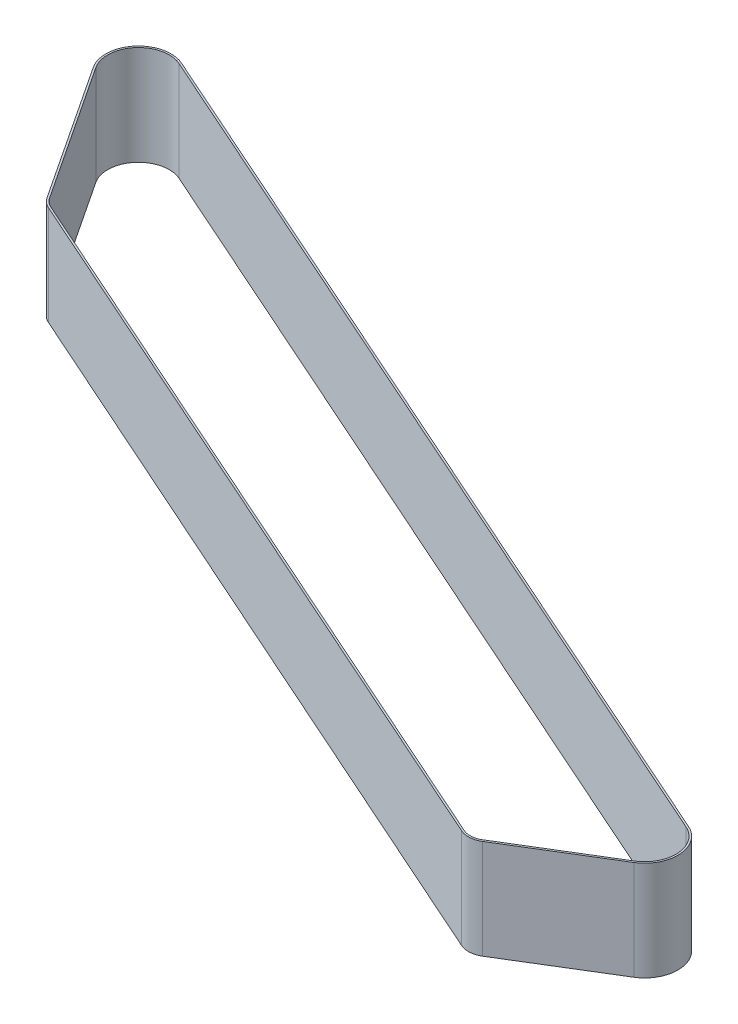
ISO-10303-21;
HEADER;
FILE_DESCRIPTION(('STEP AP214'),'2;1');
FILE_NAME('part.step','',(''),(''),'','','');
FILE_SCHEMA(('AUTOMOTIVE_DESIGN { 1 0 10303 214 1 1 1 1 }'));
ENDSEC;
DATA;
#1=APPLICATION_CONTEXT('core data for automotive mechanical design processes');
#2=APPLICATION_PROTOCOL_DEFINITION('international standard','automotive_design',2000,#1);
#3=PRODUCT_CONTEXT('',#1,'mechanical');
#4=PRODUCT('Part','Part','',(#3));
#5=PRODUCT_RELATED_PRODUCT_CATEGORY('part','',(#4));
#6=PRODUCT_DEFINITION_FORMATION('','',#4);
#7=PRODUCT_DEFINITION_CONTEXT('part definition',#1,'design');
#8=PRODUCT_DEFINITION('design','',#6,#7);
#9=PRODUCT_DEFINITION_SHAPE('','',#8);
#10=(LENGTH_UNIT() NAMED_UNIT(*) SI_UNIT(.MILLI.,.METRE.));
#11=(NAMED_UNIT(*) PLANE_ANGLE_UNIT() SI_UNIT($,.RADIAN.));
#12=(NAMED_UNIT(*) SI_UNIT($,.STERADIAN.) SOLID_ANGLE_UNIT());
#13=UNCERTAINTY_MEASURE_WITH_UNIT(LENGTH_MEASURE(1.E-05),#10,'distance_accuracy_value','');
#14=(GEOMETRIC_REPRESENTATION_CONTEXT(3) GLOBAL_UNCERTAINTY_ASSIGNED_CONTEXT((#13)) GLOBAL_UNIT_ASSIGNED_CONTEXT((#10,
#11,#12)) REPRESENTATION_CONTEXT('',''));
#15=CARTESIAN_POINT('',(0.,0.,0.));
#16=DIRECTION('',(0.,0.,1.));
#17=DIRECTION('',(1.,0.,0.));
#18=AXIS2_PLACEMENT_3D('',#15,#16,#17);
#19=CARTESIAN_POINT('',(-108.646299897246,54.,71.727165724175));
#20=DIRECTION('',(0.83453662592116,0.,-0.550952466185719));
#21=DIRECTION('',(-0.550952466185719,0.,-0.83453662592116));
#22=AXIS2_PLACEMENT_3D('',#19,#20,#21);
#23=PLANE('',#22);
#24=DIRECTION('',(0.550952466185719,0.,0.83453662592116));
#25=VECTOR('',#24,1.);
#26=CARTESIAN_POINT('',(-108.646299897246,0.,71.727165724175));
#27=LINE('',#26,#25);
#28=CARTESIAN_POINT('',(-246.078397412732,0.,-136.443458772459));
#29=VERTEX_POINT('',#28);
#30=CARTESIAN_POINT('',(-197.199257088661,0.,-62.4054330850907));
#31=VERTEX_POINT('',#30);
#32=EDGE_CURVE('E209',#29,#31,#27,.T.);
#33=ORIENTED_EDGE('',*,*,#32,.T.);
#34=DIRECTION('',(0.,-1.,0.));
#35=VECTOR('',#34,1.);
#36=CARTESIAN_POINT('',(-197.199257088661,54.,-62.4054330850907));
#37=LINE('',#36,#35);
#38=CARTESIAN_POINT('',(-197.199257088661,54.,-62.4054330850907));
#39=VERTEX_POINT('',#38);
#40=EDGE_CURVE('E11',#39,#31,#37,.T.);
#41=ORIENTED_EDGE('',*,*,#40,.F.);
#42=DIRECTION('',(0.550952466185719,0.,0.83453662592116));
#43=VECTOR('',#42,1.);
#44=CARTESIAN_POINT('',(-108.646299897246,54.,71.727165724175));
#45=LINE('',#44,#43);
#46=CARTESIAN_POINT('',(-246.078397412732,54.,-136.443458772459));
#47=VERTEX_POINT('',#46);
#48=EDGE_CURVE('E289',#47,#39,#45,.T.);
#49=ORIENTED_EDGE('',*,*,#48,.F.);
#50=DIRECTION('',(0.,-1.,0.));
#51=VECTOR('',#50,1.);
#52=CARTESIAN_POINT('',(-246.078397412732,54.,-136.443458772459));
#53=LINE('',#52,#51);
#54=EDGE_CURVE('E229',#47,#29,#53,.T.);
#55=ORIENTED_EDGE('',*,*,#54,.T.);
#56=EDGE_LOOP('',(#33,#41,#49,#55));
#57=FACE_BOUND('',#56,.T.);
#58=ADVANCED_FACE('F39',(#57),#23,.F.);
#59=CARTESIAN_POINT('',(-187.602085890568,54.,-68.7413864462265));
#60=DIRECTION('',(0.,-1.,0.));
#61=DIRECTION('',(0.,0.,-1.));
#62=AXIS2_PLACEMENT_3D('',#59,#60,#61);
#63=CYLINDRICAL_SURFACE('',#62,11.5);
#64=CARTESIAN_POINT('',(-187.602085890568,0.,-68.7413864462265));
#65=DIRECTION('',(0.,1.,0.));
#66=DIRECTION('',(0.,0.,1.));
#67=AXIS2_PLACEMENT_3D('',#64,#65,#66);
#68=CIRCLE('',#67,11.5);
#69=CARTESIAN_POINT('',(-192.288857086502,0.,-58.2397591553271));
#70=VERTEX_POINT('',#69);
#71=EDGE_CURVE('E212',#31,#70,#68,.T.);
#72=ORIENTED_EDGE('',*,*,#71,.T.);
#73=DIRECTION('',(0.,-1.,0.));
#74=VECTOR('',#73,1.);
#75=CARTESIAN_POINT('',(-192.288857086502,54.,-58.2397591553271));
#76=LINE('',#75,#74);
#77=CARTESIAN_POINT('',(-192.288857086502,54.,-58.2397591553271));
#78=VERTEX_POINT('',#77);
#79=EDGE_CURVE('E49',#78,#70,#76,.T.);
#80=ORIENTED_EDGE('',*,*,#79,.F.);
#81=CARTESIAN_POINT('',(-187.602085890568,54.,-68.7413864462265));
#82=DIRECTION('',(0.,1.,0.));
#83=DIRECTION('',(0.,0.,1.));
#84=AXIS2_PLACEMENT_3D('',#81,#82,#83);
#85=CIRCLE('',#84,11.5);
#86=EDGE_CURVE('E291',#39,#78,#85,.T.);
#87=ORIENTED_EDGE('',*,*,#86,.F.);
#88=ORIENTED_EDGE('',*,*,#40,.T.);
#89=EDGE_LOOP('',(#72,#80,#87,#88));
#90=FACE_BOUND('',#89,.T.);
#91=ADVANCED_FACE('F321',(#90),#63,.T.);
#92=CARTESIAN_POINT('',(-10.2631122090156,54.,22.9965096988866));
#93=DIRECTION('',(-0.407545321385573,0.,0.913184981817337));
#94=DIRECTION('',(0.913184981817337,0.,0.407545321385573));
#95=AXIS2_PLACEMENT_3D('',#92,#93,#94);
#96=PLANE('',#95);
#97=DIRECTION('',(-0.913184981817337,0.,-0.407545321385572));
#98=VECTOR('',#97,1.);
#99=CARTESIAN_POINT('',(-10.2631122090156,0.,22.9965096988866));
#100=LINE('',#99,#98);
#101=CARTESIAN_POINT('',(213.190233658603,0.,122.721502410731));
#102=VERTEX_POINT('',#101);
#103=EDGE_CURVE('E215',#102,#70,#100,.T.);
#104=ORIENTED_EDGE('',*,*,#103,.F.);
#105=DIRECTION('',(0.,-1.,0.));
#106=VECTOR('',#105,1.);
#107=CARTESIAN_POINT('',(213.190233658603,54.,122.721502410731));
#108=LINE('',#107,#106);
#109=CARTESIAN_POINT('',(213.190233658603,54.,122.721502410731));
#110=VERTEX_POINT('',#109);
#111=EDGE_CURVE('E235',#110,#102,#108,.T.);
#112=ORIENTED_EDGE('',*,*,#111,.F.);
#113=DIRECTION('',(-0.913184981817337,0.,-0.407545321385572));
#114=VECTOR('',#113,1.);
#115=CARTESIAN_POINT('',(-10.2631122090156,54.,22.9965096988866));
#116=LINE('',#115,#114);
#117=EDGE_CURVE('E293',#110,#78,#116,.T.);
#118=ORIENTED_EDGE('',*,*,#117,.T.);
#119=ORIENTED_EDGE('',*,*,#79,.T.);
#120=EDGE_LOOP('',(#104,#112,#118,#119));
#121=FACE_BOUND('',#120,.T.);
#122=ADVANCED_FACE('F326',(#121),#96,.T.);
#123=CARTESIAN_POINT('',(217.877004854537,54.,112.219875119832));
#124=DIRECTION('',(0.,-1.,0.));
#125=DIRECTION('',(0.,0.,-1.));
#126=AXIS2_PLACEMENT_3D('',#123,#124,#125);
#127=CYLINDRICAL_SURFACE('',#126,11.5);
#128=CARTESIAN_POINT('',(217.877004854537,0.,112.219875119832));
#129=DIRECTION('',(0.,1.,0.));
#130=DIRECTION('',(0.,0.,1.));
#131=AXIS2_PLACEMENT_3D('',#128,#129,#130);
#132=CIRCLE('',#131,11.5);
#133=CARTESIAN_POINT('',(223.875273721408,0.,122.031642065736));
#134=VERTEX_POINT('',#133);
#135=EDGE_CURVE('E218',#102,#134,#132,.T.);
#136=ORIENTED_EDGE('',*,*,#135,.T.);
#137=DIRECTION('',(0.,-1.,0.));
#138=VECTOR('',#137,1.);
#139=CARTESIAN_POINT('',(223.875273721408,54.,122.031642065736));
#140=LINE('',#139,#138);
#141=CARTESIAN_POINT('',(223.875273721408,54.,122.031642065736));
#142=VERTEX_POINT('',#141);
#143=EDGE_CURVE('E233',#142,#134,#140,.T.);
#144=ORIENTED_EDGE('',*,*,#143,.F.);
#145=CARTESIAN_POINT('',(217.877004854537,54.,112.219875119832));
#146=DIRECTION('',(0.,1.,0.));
#147=DIRECTION('',(0.,0.,1.));
#148=AXIS2_PLACEMENT_3D('',#145,#146,#147);
#149=CIRCLE('',#148,11.5);
#150=EDGE_CURVE('E296',#110,#142,#149,.T.);
#151=ORIENTED_EDGE('',*,*,#150,.F.);
#152=ORIENTED_EDGE('',*,*,#111,.T.);
#153=EDGE_LOOP('',(#136,#144,#151,#152));
#154=FACE_BOUND('',#153,.T.);
#155=ADVANCED_FACE('F359',(#154),#127,.T.);
#156=CARTESIAN_POINT('',(115.212576608811,54.,188.460866962163));
#157=DIRECTION('',(0.521588597119238,0.,0.853197125730733));
#158=DIRECTION('',(0.853197125730734,0.,-0.521588597119238));
#159=AXIS2_PLACEMENT_3D('',#156,#157,#158);
#160=PLANE('',#159);
#161=DIRECTION('',(-0.853197125730734,0.,0.521588597119238));
#162=VECTOR('',#161,1.);
#163=CARTESIAN_POINT('',(115.212576608811,0.,188.460866962163));
#164=LINE('',#163,#162);
#165=CARTESIAN_POINT('',(274.861498447239,0.,90.8620182764203));
#166=VERTEX_POINT('',#165);
#167=EDGE_CURVE('E221',#166,#134,#164,.T.);
#168=ORIENTED_EDGE('',*,*,#167,.F.);
#169=DIRECTION('',(0.,-1.,0.));
#170=VECTOR('',#169,1.);
#171=CARTESIAN_POINT('',(274.861498447239,54.,90.8620182764203));
#172=LINE('',#171,#170);
#173=CARTESIAN_POINT('',(274.861498447239,54.,90.8620182764203));
#174=VERTEX_POINT('',#173);
#175=EDGE_CURVE('E177',#174,#166,#172,.T.);
#176=ORIENTED_EDGE('',*,*,#175,.F.);
#177=DIRECTION('',(-0.853197125730734,0.,0.521588597119238));
#178=VECTOR('',#177,1.);
#179=CARTESIAN_POINT('',(115.212576608811,54.,188.460866962163));
#180=LINE('',#179,#178);
#181=EDGE_CURVE('E166',#174,#142,#180,.T.);
#182=ORIENTED_EDGE('',*,*,#181,.T.);
#183=ORIENTED_EDGE('',*,*,#143,.T.);
#184=EDGE_LOOP('',(#168,#176,#182,#183));
#185=FACE_BOUND('',#184,.T.);
#186=ADVANCED_FACE('F299',(#185),#160,.T.);
#187=CARTESIAN_POINT('',(265.472903699093,54.,75.5044700132671));
#188=DIRECTION('',(0.,-1.,0.));
#189=DIRECTION('',(0.,0.,-1.));
#190=AXIS2_PLACEMENT_3D('',#187,#188,#189);
#191=CYLINDRICAL_SURFACE('',#190,18.);
#192=CARTESIAN_POINT('',(265.472903699093,0.,75.5044700132671));
#193=DIRECTION('',(0.,1.,0.));
#194=DIRECTION('',(0.,0.,1.));
#195=AXIS2_PLACEMENT_3D('',#192,#193,#194);
#196=CIRCLE('',#195,18.);
#197=CARTESIAN_POINT('',(272.79992067022,0.,59.0632163413355));
#198=VERTEX_POINT('',#197);
#199=EDGE_CURVE('E173',#166,#198,#196,.T.);
#200=ORIENTED_EDGE('',*,*,#199,.T.);
#201=DIRECTION('',(0.,-1.,0.));
#202=VECTOR('',#201,1.);
#203=CARTESIAN_POINT('',(272.79992067022,54.,59.0632163413355));
#204=LINE('',#203,#202);
#205=CARTESIAN_POINT('',(272.79992067022,54.,59.0632163413355));
#206=VERTEX_POINT('',#205);
#207=EDGE_CURVE('E170',#206,#198,#204,.T.);
#208=ORIENTED_EDGE('',*,*,#207,.F.);
#209=CARTESIAN_POINT('',(265.472903699093,54.,75.5044700132671));
#210=DIRECTION('',(0.,1.,0.));
#211=DIRECTION('',(0.,0.,1.));
#212=AXIS2_PLACEMENT_3D('',#209,#210,#211);
#213=CIRCLE('',#212,18.);
#214=EDGE_CURVE('E160',#174,#206,#213,.T.);
#215=ORIENTED_EDGE('',*,*,#214,.F.);
#216=ORIENTED_EDGE('',*,*,#175,.T.);
#217=EDGE_LOOP('',(#200,#208,#215,#216));
#218=FACE_BOUND('',#217,.T.);
#219=ADVANCED_FACE('F171',(#218),#191,.T.);
#220=CARTESIAN_POINT('',(23.2414861169637,54.,-52.1520791431807));
#221=DIRECTION('',(0.407056498395983,0.,-0.913402981773982));
#222=DIRECTION('',(-0.913402981773982,0.,-0.407056498395983));
#223=AXIS2_PLACEMENT_3D('',#220,#221,#222);
#224=PLANE('',#223);
#225=DIRECTION('',(0.913402981773982,0.,0.407056498395983));
#226=VECTOR('',#225,1.);
#227=CARTESIAN_POINT('',(23.2414861169637,0.,-52.1520791431807));
#228=LINE('',#227,#226);
#229=CARTESIAN_POINT('',(-224.091230242141,0.,-162.375487068092));
#230=VERTEX_POINT('',#229);
#231=EDGE_CURVE('E225',#230,#198,#228,.T.);
#232=ORIENTED_EDGE('',*,*,#231,.F.);
#233=DIRECTION('',(0.,-1.,0.));
#234=VECTOR('',#233,1.);
#235=CARTESIAN_POINT('',(-224.091230242141,54.,-162.375487068092));
#236=LINE('',#235,#234);
#237=CARTESIAN_POINT('',(-224.091230242141,54.,-162.375487068092));
#238=VERTEX_POINT('',#237);
#239=EDGE_CURVE('E110',#238,#230,#236,.T.);
#240=ORIENTED_EDGE('',*,*,#239,.F.);
#241=DIRECTION('',(0.913402981773982,0.,0.407056498395983));
#242=VECTOR('',#241,1.);
#243=CARTESIAN_POINT('',(23.2414861169637,54.,-52.1520791431807));
#244=LINE('',#243,#242);
#245=EDGE_CURVE('E164',#238,#206,#244,.T.);
#246=ORIENTED_EDGE('',*,*,#245,.T.);
#247=ORIENTED_EDGE('',*,*,#207,.T.);
#248=EDGE_LOOP('',(#232,#240,#246,#247));
#249=FACE_BOUND('',#248,.T.);
#250=ADVANCED_FACE('F179',(#249),#224,.T.);
#251=CARTESIAN_POINT('',(-187.602085890568,54.,-68.7413864462265));
#252=DIRECTION('',(0.,-1.,0.));
#253=DIRECTION('',(0.,0.,-1.));
#254=AXIS2_PLACEMENT_3D('',#251,#252,#253);
#255=CYLINDRICAL_SURFACE('',#254,10.5);
#256=CARTESIAN_POINT('',(-187.602085890568,0.,-68.7413864462265));
#257=DIRECTION('',(0.,1.,0.));
#258=DIRECTION('',(0.,0.,1.));
#259=AXIS2_PLACEMENT_3D('',#256,#257,#258);
#260=CIRCLE('',#259,10.5);
#261=CARTESIAN_POINT('',(-196.196902859554,0.,-62.7098757507513));
#262=VERTEX_POINT('',#261);
#263=CARTESIAN_POINT('',(-191.881311765116,0.,-59.1529441371446));
#264=VERTEX_POINT('',#263);
#265=EDGE_CURVE('E185',#262,#264,#260,.T.);
#266=ORIENTED_EDGE('',*,*,#265,.F.);
#267=DIRECTION('',(0.,-1.,0.));
#268=VECTOR('',#267,1.);
#269=CARTESIAN_POINT('',(-196.196902859554,54.,-62.7098757507513));
#270=LINE('',#269,#268);
#271=CARTESIAN_POINT('',(-196.196902859554,54.,-62.7098757507513));
#272=VERTEX_POINT('',#271);
#273=EDGE_CURVE('E43',#272,#262,#270,.T.);
#274=ORIENTED_EDGE('',*,*,#273,.F.);
#275=CARTESIAN_POINT('',(-187.602085890568,54.,-68.7413864462265));
#276=DIRECTION('',(0.,1.,0.));
#277=DIRECTION('',(0.,0.,1.));
#278=AXIS2_PLACEMENT_3D('',#275,#276,#277);
#279=CIRCLE('',#278,10.5);
#280=CARTESIAN_POINT('',(-191.881311765116,54.,-59.1529441371446));
#281=VERTEX_POINT('',#280);
#282=EDGE_CURVE('E228',#272,#281,#279,.T.);
#283=ORIENTED_EDGE('',*,*,#282,.T.);
#284=DIRECTION('',(0.,-1.,0.));
#285=VECTOR('',#284,1.);
#286=CARTESIAN_POINT('',(-191.881311765116,54.,-59.1529441371446));
#287=LINE('',#286,#285);
#288=EDGE_CURVE('E181',#281,#264,#287,.T.);
#289=ORIENTED_EDGE('',*,*,#288,.T.);
#290=EDGE_LOOP('',(#266,#274,#283,#289));
#291=FACE_BOUND('',#290,.T.);
#292=ADVANCED_FACE('F41',(#291),#255,.F.);
#293=CARTESIAN_POINT('',(-107.798473941414,54.,71.1748034944468));
#294=DIRECTION('',(0.834510414456251,0.,-0.550992167062342));
#295=DIRECTION('',(-0.550992167062342,0.,-0.834510414456251));
#296=AXIS2_PLACEMENT_3D('',#293,#294,#295);
#297=PLANE('',#296);
#298=DIRECTION('',(0.550992167062342,0.,0.834510414456251));
#299=VECTOR('',#298,1.);
#300=CARTESIAN_POINT('',(-107.798473941414,0.,71.1748034944468));
#301=LINE('',#300,#299);
#302=CARTESIAN_POINT('',(-245.243860786811,0.,-136.994411238645));
#303=VERTEX_POINT('',#302);
#304=EDGE_CURVE('E188',#303,#262,#301,.T.);
#305=ORIENTED_EDGE('',*,*,#304,.F.);
#306=DIRECTION('',(0.,-1.,0.));
#307=VECTOR('',#306,1.);
#308=CARTESIAN_POINT('',(-245.243860786811,54.,-136.994411238645));
#309=LINE('',#308,#307);
#310=CARTESIAN_POINT('',(-245.243860786811,54.,-136.994411238645));
#311=VERTEX_POINT('',#310);
#312=EDGE_CURVE('E248',#311,#303,#309,.T.);
#313=ORIENTED_EDGE('',*,*,#312,.F.);
#314=DIRECTION('',(0.550992167062342,0.,0.834510414456251));
#315=VECTOR('',#314,1.);
#316=CARTESIAN_POINT('',(-107.798473941414,54.,71.1748034944468));
#317=LINE('',#316,#315);
#318=EDGE_CURVE('E257',#311,#272,#317,.T.);
#319=ORIENTED_EDGE('',*,*,#318,.T.);
#320=ORIENTED_EDGE('',*,*,#273,.T.);
#321=EDGE_LOOP('',(#305,#313,#319,#320));
#322=FACE_BOUND('',#321,.T.);
#323=ADVANCED_FACE('F255',(#322),#297,.T.);
#324=CARTESIAN_POINT('',(-231.299726409539,54.,-146.200184820485));
#325=DIRECTION('',(0.,-1.,0.));
#326=DIRECTION('',(0.,0.,-1.));
#327=AXIS2_PLACEMENT_3D('',#324,#325,#326);
#328=CYLINDRICAL_SURFACE('',#327,16.7088345126619);
#329=CARTESIAN_POINT('',(-231.299726409539,0.,-146.200184820485));
#330=DIRECTION('',(0.,1.,0.));
#331=DIRECTION('',(0.,0.,1.));
#332=AXIS2_PLACEMENT_3D('',#329,#330,#331);
#333=CIRCLE('',#332,16.7088345126619);
#334=CARTESIAN_POINT('',(-224.498286740537,0.,-161.462084086318));
#335=VERTEX_POINT('',#334);
#336=EDGE_CURVE('E191',#335,#303,#333,.T.);
#337=ORIENTED_EDGE('',*,*,#336,.F.);
#338=DIRECTION('',(0.,-1.,0.));
#339=VECTOR('',#338,1.);
#340=CARTESIAN_POINT('',(-224.498286740537,54.,-161.462084086318));
#341=LINE('',#340,#339);
#342=CARTESIAN_POINT('',(-224.498286740537,54.,-161.462084086318));
#343=VERTEX_POINT('',#342);
#344=EDGE_CURVE('E247',#343,#335,#341,.T.);
#345=ORIENTED_EDGE('',*,*,#344,.F.);
#346=CARTESIAN_POINT('',(-231.299726409539,54.,-146.200184820485));
#347=DIRECTION('',(0.,1.,0.));
#348=DIRECTION('',(0.,0.,1.));
#349=AXIS2_PLACEMENT_3D('',#346,#347,#348);
#350=CIRCLE('',#349,16.7088345126619);
#351=EDGE_CURVE('E267',#343,#311,#350,.T.);
#352=ORIENTED_EDGE('',*,*,#351,.T.);
#353=ORIENTED_EDGE('',*,*,#312,.T.);
#354=EDGE_LOOP('',(#337,#345,#352,#353));
#355=FACE_BOUND('',#354,.T.);
#356=ADVANCED_FACE('F264',(#355),#328,.F.);
#357=CARTESIAN_POINT('',(22.8344296185678,54.,-51.2386761614067));
#358=DIRECTION('',(0.407056498395983,0.,-0.913402981773982));
#359=DIRECTION('',(-0.913402981773982,0.,-0.407056498395983));
#360=AXIS2_PLACEMENT_3D('',#357,#358,#359);
#361=PLANE('',#360);
#362=DIRECTION('',(0.913402981773982,0.,0.407056498395983));
#363=VECTOR('',#362,1.);
#364=CARTESIAN_POINT('',(22.8344296185678,0.,-51.2386761614067));
#365=LINE('',#364,#363);
#366=CARTESIAN_POINT('',(272.392864171824,0.,59.9766193231095));
#367=VERTEX_POINT('',#366);
#368=EDGE_CURVE('E194',#335,#367,#365,.T.);
#369=ORIENTED_EDGE('',*,*,#368,.T.);
#370=DIRECTION('',(0.,-1.,0.));
#371=VECTOR('',#370,1.);
#372=CARTESIAN_POINT('',(272.392864171824,54.,59.9766193231095));
#373=LINE('',#372,#371);
#374=CARTESIAN_POINT('',(272.392864171824,54.,59.9766193231095));
#375=VERTEX_POINT('',#374);
#376=EDGE_CURVE('E245',#375,#367,#373,.T.);
#377=ORIENTED_EDGE('',*,*,#376,.F.);
#378=DIRECTION('',(0.913402981773982,0.,0.407056498395983));
#379=VECTOR('',#378,1.);
#380=CARTESIAN_POINT('',(22.8344296185678,54.,-51.2386761614067));
#381=LINE('',#380,#379);
#382=EDGE_CURVE('E270',#343,#375,#381,.T.);
#383=ORIENTED_EDGE('',*,*,#382,.F.);
#384=ORIENTED_EDGE('',*,*,#344,.T.);
#385=EDGE_LOOP('',(#369,#377,#383,#384));
#386=FACE_BOUND('',#385,.T.);
#387=ADVANCED_FACE('F271',(#386),#361,.F.);
#388=CARTESIAN_POINT('',(265.472903699093,54.,75.5044700132671));
#389=DIRECTION('',(0.,-1.,0.));
#390=DIRECTION('',(0.,0.,-1.));
#391=AXIS2_PLACEMENT_3D('',#388,#389,#390);
#392=CYLINDRICAL_SURFACE('',#391,17.);
#393=CARTESIAN_POINT('',(265.472903699093,0.,75.5044700132671));
#394=DIRECTION('',(0.,1.,0.));
#395=DIRECTION('',(0.,0.,1.));
#396=AXIS2_PLACEMENT_3D('',#393,#394,#395);
#397=CIRCLE('',#396,17.);
#398=CARTESIAN_POINT('',(274.33990985012,0.,90.0088211506896));
#399=VERTEX_POINT('',#398);
#400=EDGE_CURVE('E197',#399,#367,#397,.T.);
#401=ORIENTED_EDGE('',*,*,#400,.F.);
#402=DIRECTION('',(0.,-1.,0.));
#403=VECTOR('',#402,1.);
#404=CARTESIAN_POINT('',(274.33990985012,54.,90.0088211506896));
#405=LINE('',#404,#403);
#406=CARTESIAN_POINT('',(274.33990985012,54.,90.0088211506896));
#407=VERTEX_POINT('',#406);
#408=EDGE_CURVE('E243',#407,#399,#405,.T.);
#409=ORIENTED_EDGE('',*,*,#408,.F.);
#410=CARTESIAN_POINT('',(265.472903699093,54.,75.5044700132671));
#411=DIRECTION('',(0.,1.,0.));
#412=DIRECTION('',(0.,0.,1.));
#413=AXIS2_PLACEMENT_3D('',#410,#411,#412);
#414=CIRCLE('',#413,17.);
#415=EDGE_CURVE('E275',#407,#375,#414,.T.);
#416=ORIENTED_EDGE('',*,*,#415,.T.);
#417=ORIENTED_EDGE('',*,*,#376,.T.);
#418=EDGE_LOOP('',(#401,#409,#416,#417));
#419=FACE_BOUND('',#418,.T.);
#420=ADVANCED_FACE('F337',(#419),#392,.F.);
#421=CARTESIAN_POINT('',(114.341079740645,54.,187.552072650847));
#422=DIRECTION('',(0.520541248288725,0.,0.853836523480939));
#423=DIRECTION('',(0.853836523480939,0.,-0.520541248288725));
#424=AXIS2_PLACEMENT_3D('',#421,#422,#423);
#425=PLANE('',#424);
#426=DIRECTION('',(-0.853836523480939,0.,0.520541248288725));
#427=VECTOR('',#426,1.);
#428=CARTESIAN_POINT('',(114.341079740645,0.,187.552072650847));
#429=LINE('',#428,#427);
#430=CARTESIAN_POINT('',(222.246746967153,0.,121.767406416939));
#431=VERTEX_POINT('',#430);
#432=EDGE_CURVE('E200',#399,#431,#429,.T.);
#433=ORIENTED_EDGE('',*,*,#432,.T.);
#434=DIRECTION('',(0.,-1.,0.));
#435=VECTOR('',#434,1.);
#436=CARTESIAN_POINT('',(222.246746967153,54.,121.767406416939));
#437=LINE('',#436,#435);
#438=CARTESIAN_POINT('',(222.246746967153,54.,121.767406416939));
#439=VERTEX_POINT('',#438);
#440=EDGE_CURVE('E241',#439,#431,#437,.T.);
#441=ORIENTED_EDGE('',*,*,#440,.F.);
#442=DIRECTION('',(-0.853836523480939,0.,0.520541248288725));
#443=VECTOR('',#442,1.);
#444=CARTESIAN_POINT('',(114.341079740645,54.,187.552072650847));
#445=LINE('',#444,#443);
#446=EDGE_CURVE('E282',#407,#439,#445,.T.);
#447=ORIENTED_EDGE('',*,*,#446,.F.);
#448=ORIENTED_EDGE('',*,*,#408,.T.);
#449=EDGE_LOOP('',(#433,#441,#447,#448));
#450=FACE_BOUND('',#449,.T.);
#451=ADVANCED_FACE('F333',(#450),#425,.F.);
#452=CARTESIAN_POINT('',(217.877004854537,54.,112.219875119832));
#453=DIRECTION('',(0.,-1.,0.));
#454=DIRECTION('',(0.,0.,-1.));
#455=AXIS2_PLACEMENT_3D('',#452,#453,#454);
#456=CYLINDRICAL_SURFACE('',#455,10.5);
#457=CARTESIAN_POINT('',(217.877004854537,0.,112.219875119832));
#458=DIRECTION('',(0.,1.,0.));
#459=DIRECTION('',(0.,0.,1.));
#460=AXIS2_PLACEMENT_3D('',#457,#458,#459);
#461=CIRCLE('',#460,10.5);
#462=CARTESIAN_POINT('',(213.597778979989,0.,121.808317428914));
#463=VERTEX_POINT('',#462);
#464=EDGE_CURVE('E203',#463,#431,#461,.T.);
#465=ORIENTED_EDGE('',*,*,#464,.F.);
#466=DIRECTION('',(0.,-1.,0.));
#467=VECTOR('',#466,1.);
#468=CARTESIAN_POINT('',(213.597778979989,54.,121.808317428914));
#469=LINE('',#468,#467);
#470=CARTESIAN_POINT('',(213.597778979989,54.,121.808317428914));
#471=VERTEX_POINT('',#470);
#472=EDGE_CURVE('E239',#471,#463,#469,.T.);
#473=ORIENTED_EDGE('',*,*,#472,.F.);
#474=CARTESIAN_POINT('',(217.877004854537,54.,112.219875119832));
#475=DIRECTION('',(0.,1.,0.));
#476=DIRECTION('',(0.,0.,1.));
#477=AXIS2_PLACEMENT_3D('',#474,#475,#476);
#478=CIRCLE('',#477,10.5);
#479=EDGE_CURVE('E284',#471,#439,#478,.T.);
#480=ORIENTED_EDGE('',*,*,#479,.T.);
#481=ORIENTED_EDGE('',*,*,#440,.T.);
#482=EDGE_LOOP('',(#465,#473,#480,#481));
#483=FACE_BOUND('',#482,.T.);
#484=ADVANCED_FACE('F315',(#483),#456,.F.);
#485=CARTESIAN_POINT('',(-9.85556688762996,54.,22.0833247170692));
#486=DIRECTION('',(-0.407545321385573,0.,0.913184981817337));
#487=DIRECTION('',(0.913184981817337,0.,0.407545321385573));
#488=AXIS2_PLACEMENT_3D('',#485,#486,#487);
#489=PLANE('',#488);
#490=DIRECTION('',(-0.913184981817337,0.,-0.407545321385573));
#491=VECTOR('',#490,1.);
#492=CARTESIAN_POINT('',(-9.85556688762996,0.,22.0833247170692));
#493=LINE('',#492,#491);
#494=EDGE_CURVE('E206',#463,#264,#493,.T.);
#495=ORIENTED_EDGE('',*,*,#494,.T.);
#496=ORIENTED_EDGE('',*,*,#288,.F.);
#497=DIRECTION('',(-0.913184981817337,0.,-0.407545321385573));
#498=VECTOR('',#497,1.);
#499=CARTESIAN_POINT('',(-9.85556688762996,54.,22.0833247170692));
#500=LINE('',#499,#498);
#501=EDGE_CURVE('E287',#471,#281,#500,.T.);
#502=ORIENTED_EDGE('',*,*,#501,.F.);
#503=ORIENTED_EDGE('',*,*,#472,.T.);
#504=EDGE_LOOP('',(#495,#496,#502,#503));
#505=FACE_BOUND('',#504,.T.);
#506=ADVANCED_FACE('F308',(#505),#489,.F.);
#507=CARTESIAN_POINT('',(-231.299726409539,54.,-146.200184820485));
#508=DIRECTION('',(0.,-1.,0.));
#509=DIRECTION('',(0.,0.,-1.));
#510=AXIS2_PLACEMENT_3D('',#507,#508,#509);
#511=CYLINDRICAL_SURFACE('',#510,17.7088345126619);
#512=CARTESIAN_POINT('',(-231.299726409539,0.,-146.200184820485));
#513=DIRECTION('',(0.,1.,0.));
#514=DIRECTION('',(0.,0.,1.));
#515=AXIS2_PLACEMENT_3D('',#512,#513,#514);
#516=CIRCLE('',#515,17.7088345126619);
#517=EDGE_CURVE('E113',#230,#29,#516,.T.);
#518=ORIENTED_EDGE('',*,*,#517,.T.);
#519=ORIENTED_EDGE('',*,*,#54,.F.);
#520=CARTESIAN_POINT('',(-231.299726409539,54.,-146.200184820485));
#521=DIRECTION('',(0.,1.,0.));
#522=DIRECTION('',(0.,0.,1.));
#523=AXIS2_PLACEMENT_3D('',#520,#521,#522);
#524=CIRCLE('',#523,17.7088345126619);
#525=EDGE_CURVE('E58',#238,#47,#524,.T.);
#526=ORIENTED_EDGE('',*,*,#525,.F.);
#527=ORIENTED_EDGE('',*,*,#239,.T.);
#528=EDGE_LOOP('',(#518,#519,#526,#527));
#529=FACE_BOUND('',#528,.T.);
#530=ADVANCED_FACE('F306',(#529),#511,.T.);
#531=CARTESIAN_POINT('',(0.,54.,0.));
#532=DIRECTION('',(0.,1.,0.));
#533=DIRECTION('',(0.,0.,1.));
#534=AXIS2_PLACEMENT_3D('',#531,#532,#533);
#535=PLANE('',#534);
#536=ORIENTED_EDGE('',*,*,#282,.F.);
#537=ORIENTED_EDGE('',*,*,#318,.F.);
#538=ORIENTED_EDGE('',*,*,#351,.F.);
#539=ORIENTED_EDGE('',*,*,#382,.T.);
#540=ORIENTED_EDGE('',*,*,#415,.F.);
#541=ORIENTED_EDGE('',*,*,#446,.T.);
#542=ORIENTED_EDGE('',*,*,#479,.F.);
#543=ORIENTED_EDGE('',*,*,#501,.T.);
#544=EDGE_LOOP('',(#536,#537,#538,#539,#540,#541,#542,#543));
#545=FACE_BOUND('',#544,.T.);
#546=ORIENTED_EDGE('',*,*,#48,.T.);
#547=ORIENTED_EDGE('',*,*,#86,.T.);
#548=ORIENTED_EDGE('',*,*,#117,.F.);
#549=ORIENTED_EDGE('',*,*,#150,.T.);
#550=ORIENTED_EDGE('',*,*,#181,.F.);
#551=ORIENTED_EDGE('',*,*,#214,.T.);
#552=ORIENTED_EDGE('',*,*,#245,.F.);
#553=ORIENTED_EDGE('',*,*,#525,.T.);
#554=EDGE_LOOP('',(#546,#547,#548,#549,#550,#551,#552,#553));
#555=FACE_BOUND('',#554,.T.);
#556=ADVANCED_FACE('F162',(#545,#555),#535,.T.);
#557=CARTESIAN_POINT('',(0.,0.,0.));
#558=DIRECTION('',(0.,1.,0.));
#559=DIRECTION('',(0.,0.,1.));
#560=AXIS2_PLACEMENT_3D('',#557,#558,#559);
#561=PLANE('',#560);
#562=ORIENTED_EDGE('',*,*,#265,.T.);
#563=ORIENTED_EDGE('',*,*,#494,.F.);
#564=ORIENTED_EDGE('',*,*,#464,.T.);
#565=ORIENTED_EDGE('',*,*,#432,.F.);
#566=ORIENTED_EDGE('',*,*,#400,.T.);
#567=ORIENTED_EDGE('',*,*,#368,.F.);
#568=ORIENTED_EDGE('',*,*,#336,.T.);
#569=ORIENTED_EDGE('',*,*,#304,.T.);
#570=EDGE_LOOP('',(#562,#563,#564,#565,#566,#567,#568,#569));
#571=FACE_BOUND('',#570,.T.);
#572=ORIENTED_EDGE('',*,*,#32,.F.);
#573=ORIENTED_EDGE('',*,*,#517,.F.);
#574=ORIENTED_EDGE('',*,*,#231,.T.);
#575=ORIENTED_EDGE('',*,*,#199,.F.);
#576=ORIENTED_EDGE('',*,*,#167,.T.);
#577=ORIENTED_EDGE('',*,*,#135,.F.);
#578=ORIENTED_EDGE('',*,*,#103,.T.);
#579=ORIENTED_EDGE('',*,*,#71,.F.);
#580=EDGE_LOOP('',(#572,#573,#574,#575,#576,#577,#578,#579));
#581=FACE_BOUND('',#580,.T.);
#582=ADVANCED_FACE('F261',(#571,#581),#561,.F.);
#583=CLOSED_SHELL('',(#58,#91,#122,#155,#186,#219,#250,#292,#323,#356,#387,#420,#451,#484,#506,
#530,#556,#582));
#584=MANIFOLD_SOLID_BREP('B2',#583);
#585=ADVANCED_BREP_SHAPE_REPRESENTATION('',(#18,#584),#14);
#586=SHAPE_DEFINITION_REPRESENTATION(#9,#585);
ENDSEC;
END-ISO-10303-21;
